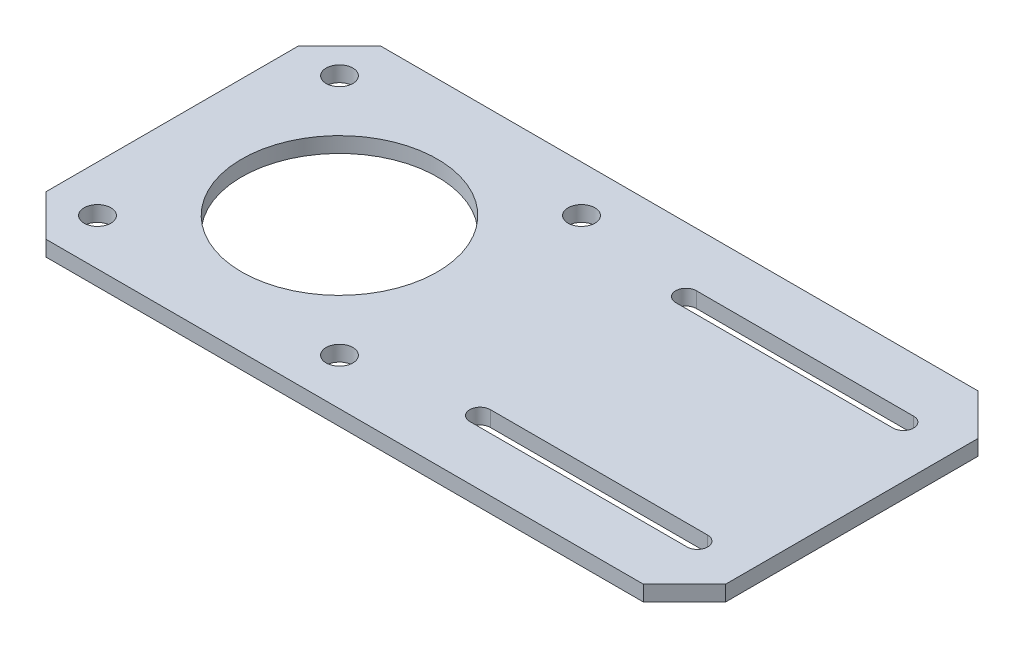
ISO-10303-21;
HEADER;
FILE_DESCRIPTION(('STEP AP214'),'2;1');
FILE_NAME('part.step','',(''),(''),'','','');
FILE_SCHEMA(('AUTOMOTIVE_DESIGN { 1 0 10303 214 1 1 1 1 }'));
ENDSEC;
DATA;
#1=APPLICATION_CONTEXT('core data for automotive mechanical design processes');
#2=APPLICATION_PROTOCOL_DEFINITION('international standard','automotive_design',2000,#1);
#3=PRODUCT_CONTEXT('',#1,'mechanical');
#4=PRODUCT('Part','Part','',(#3));
#5=PRODUCT_RELATED_PRODUCT_CATEGORY('part','',(#4));
#6=PRODUCT_DEFINITION_FORMATION('','',#4);
#7=PRODUCT_DEFINITION_CONTEXT('part definition',#1,'design');
#8=PRODUCT_DEFINITION('design','',#6,#7);
#9=PRODUCT_DEFINITION_SHAPE('','',#8);
#10=(LENGTH_UNIT() NAMED_UNIT(*) SI_UNIT(.MILLI.,.METRE.));
#11=(NAMED_UNIT(*) PLANE_ANGLE_UNIT() SI_UNIT($,.RADIAN.));
#12=(NAMED_UNIT(*) SI_UNIT($,.STERADIAN.) SOLID_ANGLE_UNIT());
#13=UNCERTAINTY_MEASURE_WITH_UNIT(LENGTH_MEASURE(1.E-05),#10,'distance_accuracy_value','');
#14=(GEOMETRIC_REPRESENTATION_CONTEXT(3) GLOBAL_UNCERTAINTY_ASSIGNED_CONTEXT((#13)) GLOBAL_UNIT_ASSIGNED_CONTEXT((#10,
#11,#12)) REPRESENTATION_CONTEXT('',''));
#15=CARTESIAN_POINT('',(0.,0.,0.));
#16=DIRECTION('',(0.,0.,1.));
#17=DIRECTION('',(1.,0.,0.));
#18=AXIS2_PLACEMENT_3D('',#15,#16,#17);
#19=CARTESIAN_POINT('',(0.,3.,0.));
#20=DIRECTION('',(1.,0.,0.));
#21=DIRECTION('',(0.,0.,-1.));
#22=AXIS2_PLACEMENT_3D('',#19,#20,#21);
#23=PLANE('',#22);
#24=DIRECTION('',(0.,0.,1.));
#25=VECTOR('',#24,1.);
#26=CARTESIAN_POINT('',(0.,0.,0.));
#27=LINE('',#26,#25);
#28=CARTESIAN_POINT('',(0.,0.,8.00000000000002));
#29=VERTEX_POINT('',#28);
#30=CARTESIAN_POINT('',(0.,0.,57.));
#31=VERTEX_POINT('',#30);
#32=EDGE_CURVE('E253',#29,#31,#27,.T.);
#33=ORIENTED_EDGE('',*,*,#32,.T.);
#34=DIRECTION('',(0.,1.,0.));
#35=VECTOR('',#34,1.);
#36=CARTESIAN_POINT('',(0.,3.,57.));
#37=LINE('',#36,#35);
#38=CARTESIAN_POINT('',(0.,3.,57.));
#39=VERTEX_POINT('',#38);
#40=EDGE_CURVE('E295',#31,#39,#37,.T.);
#41=ORIENTED_EDGE('',*,*,#40,.T.);
#42=DIRECTION('',(0.,0.,1.));
#43=VECTOR('',#42,1.);
#44=CARTESIAN_POINT('',(0.,3.,0.));
#45=LINE('',#44,#43);
#46=CARTESIAN_POINT('',(0.,3.,8.00000000000002));
#47=VERTEX_POINT('',#46);
#48=EDGE_CURVE('E256',#47,#39,#45,.T.);
#49=ORIENTED_EDGE('',*,*,#48,.F.);
#50=DIRECTION('',(0.,-1.,0.));
#51=VECTOR('',#50,1.);
#52=CARTESIAN_POINT('',(0.,3.,8.00000000000002));
#53=LINE('',#52,#51);
#54=EDGE_CURVE('E292',#47,#29,#53,.T.);
#55=ORIENTED_EDGE('',*,*,#54,.T.);
#56=EDGE_LOOP('',(#33,#41,#49,#55));
#57=FACE_BOUND('',#56,.T.);
#58=ADVANCED_FACE('F43',(#57),#23,.F.);
#59=CARTESIAN_POINT('',(0.,3.,65.));
#60=DIRECTION('',(0.,0.,-1.));
#61=DIRECTION('',(-1.,0.,0.));
#62=AXIS2_PLACEMENT_3D('',#59,#60,#61);
#63=PLANE('',#62);
#64=DIRECTION('',(1.,0.,0.));
#65=VECTOR('',#64,1.);
#66=CARTESIAN_POINT('',(0.,3.,65.));
#67=LINE('',#66,#65);
#68=CARTESIAN_POINT('',(8.,3.,65.));
#69=VERTEX_POINT('',#68);
#70=CARTESIAN_POINT('',(124.,3.,65.));
#71=VERTEX_POINT('',#70);
#72=EDGE_CURVE('E259',#69,#71,#67,.T.);
#73=ORIENTED_EDGE('',*,*,#72,.F.);
#74=DIRECTION('',(0.,-1.,0.));
#75=VECTOR('',#74,1.);
#76=CARTESIAN_POINT('',(8.,3.,65.));
#77=LINE('',#76,#75);
#78=CARTESIAN_POINT('',(8.,0.,65.));
#79=VERTEX_POINT('',#78);
#80=EDGE_CURVE('E281',#69,#79,#77,.T.);
#81=ORIENTED_EDGE('',*,*,#80,.T.);
#82=DIRECTION('',(1.,0.,0.));
#83=VECTOR('',#82,1.);
#84=CARTESIAN_POINT('',(0.,0.,65.));
#85=LINE('',#84,#83);
#86=CARTESIAN_POINT('',(124.,0.,65.));
#87=VERTEX_POINT('',#86);
#88=EDGE_CURVE('E272',#79,#87,#85,.T.);
#89=ORIENTED_EDGE('',*,*,#88,.T.);
#90=DIRECTION('',(0.,1.,0.));
#91=VECTOR('',#90,1.);
#92=CARTESIAN_POINT('',(124.,3.,65.));
#93=LINE('',#92,#91);
#94=EDGE_CURVE('E269',#87,#71,#93,.T.);
#95=ORIENTED_EDGE('',*,*,#94,.T.);
#96=EDGE_LOOP('',(#73,#81,#89,#95));
#97=FACE_BOUND('',#96,.T.);
#98=ADVANCED_FACE('F345',(#97),#63,.F.);
#99=CARTESIAN_POINT('',(132.,3.,0.));
#100=DIRECTION('',(-1.,0.,0.));
#101=DIRECTION('',(0.,0.,1.));
#102=AXIS2_PLACEMENT_3D('',#99,#100,#101);
#103=PLANE('',#102);
#104=DIRECTION('',(0.,0.,-1.));
#105=VECTOR('',#104,1.);
#106=CARTESIAN_POINT('',(132.,0.,0.));
#107=LINE('',#106,#105);
#108=CARTESIAN_POINT('',(132.,0.,57.));
#109=VERTEX_POINT('',#108);
#110=CARTESIAN_POINT('',(132.,0.,8.00000000000005));
#111=VERTEX_POINT('',#110);
#112=EDGE_CURVE('E275',#109,#111,#107,.T.);
#113=ORIENTED_EDGE('',*,*,#112,.T.);
#114=DIRECTION('',(0.,1.,0.));
#115=VECTOR('',#114,1.);
#116=CARTESIAN_POINT('',(132.,3.,8.00000000000005));
#117=LINE('',#116,#115);
#118=CARTESIAN_POINT('',(132.,3.,8.00000000000005));
#119=VERTEX_POINT('',#118);
#120=EDGE_CURVE('E11',#111,#119,#117,.T.);
#121=ORIENTED_EDGE('',*,*,#120,.T.);
#122=DIRECTION('',(0.,0.,-1.));
#123=VECTOR('',#122,1.);
#124=CARTESIAN_POINT('',(132.,3.,0.));
#125=LINE('',#124,#123);
#126=CARTESIAN_POINT('',(132.,3.,57.));
#127=VERTEX_POINT('',#126);
#128=EDGE_CURVE('E263',#127,#119,#125,.T.);
#129=ORIENTED_EDGE('',*,*,#128,.F.);
#130=DIRECTION('',(0.,-1.,0.));
#131=VECTOR('',#130,1.);
#132=CARTESIAN_POINT('',(132.,3.,57.));
#133=LINE('',#132,#131);
#134=EDGE_CURVE('E52',#127,#109,#133,.T.);
#135=ORIENTED_EDGE('',*,*,#134,.T.);
#136=EDGE_LOOP('',(#113,#121,#129,#135));
#137=FACE_BOUND('',#136,.T.);
#138=ADVANCED_FACE('F314',(#137),#103,.F.);
#139=CARTESIAN_POINT('',(0.,3.,0.));
#140=DIRECTION('',(0.,0.,1.));
#141=DIRECTION('',(1.,0.,0.));
#142=AXIS2_PLACEMENT_3D('',#139,#140,#141);
#143=PLANE('',#142);
#144=DIRECTION('',(-1.,0.,0.));
#145=VECTOR('',#144,1.);
#146=CARTESIAN_POINT('',(0.,0.,0.));
#147=LINE('',#146,#145);
#148=CARTESIAN_POINT('',(124.,0.,0.));
#149=VERTEX_POINT('',#148);
#150=CARTESIAN_POINT('',(8.00000000000005,0.,0.));
#151=VERTEX_POINT('',#150);
#152=EDGE_CURVE('E260',#149,#151,#147,.T.);
#153=ORIENTED_EDGE('',*,*,#152,.T.);
#154=DIRECTION('',(0.,1.,0.));
#155=VECTOR('',#154,1.);
#156=CARTESIAN_POINT('',(8.00000000000005,3.,0.));
#157=LINE('',#156,#155);
#158=CARTESIAN_POINT('',(8.00000000000005,3.,0.));
#159=VERTEX_POINT('',#158);
#160=EDGE_CURVE('E308',#151,#159,#157,.T.);
#161=ORIENTED_EDGE('',*,*,#160,.T.);
#162=DIRECTION('',(-1.,0.,0.));
#163=VECTOR('',#162,1.);
#164=CARTESIAN_POINT('',(0.,3.,0.));
#165=LINE('',#164,#163);
#166=CARTESIAN_POINT('',(124.,3.,0.));
#167=VERTEX_POINT('',#166);
#168=EDGE_CURVE('E266',#167,#159,#165,.T.);
#169=ORIENTED_EDGE('',*,*,#168,.F.);
#170=DIRECTION('',(0.,-1.,0.));
#171=VECTOR('',#170,1.);
#172=CARTESIAN_POINT('',(124.,3.,0.));
#173=LINE('',#172,#171);
#174=EDGE_CURVE('E305',#167,#149,#173,.T.);
#175=ORIENTED_EDGE('',*,*,#174,.T.);
#176=EDGE_LOOP('',(#153,#161,#169,#175));
#177=FACE_BOUND('',#176,.T.);
#178=ADVANCED_FACE('F327',(#177),#143,.F.);
#179=CARTESIAN_POINT('',(0.,3.,0.));
#180=DIRECTION('',(0.,1.,0.));
#181=DIRECTION('',(0.,0.,1.));
#182=AXIS2_PLACEMENT_3D('',#179,#180,#181);
#183=PLANE('',#182);
#184=CARTESIAN_POINT('',(122.,3.,12.5));
#185=DIRECTION('',(0.,1.,0.));
#186=DIRECTION('',(0.,0.,1.));
#187=AXIS2_PLACEMENT_3D('',#184,#185,#186);
#188=CIRCLE('',#187,2.);
#189=CARTESIAN_POINT('',(122.,3.,14.5));
#190=VERTEX_POINT('',#189);
#191=CARTESIAN_POINT('',(122.,3.,10.5));
#192=VERTEX_POINT('',#191);
#193=EDGE_CURVE('E59',#190,#192,#188,.T.);
#194=ORIENTED_EDGE('',*,*,#193,.F.);
#195=DIRECTION('',(1.,0.,0.));
#196=VECTOR('',#195,1.);
#197=CARTESIAN_POINT('',(122.,3.,14.5));
#198=LINE('',#197,#196);
#199=CARTESIAN_POINT('',(79.8,3.,14.5));
#200=VERTEX_POINT('',#199);
#201=EDGE_CURVE('E177',#200,#190,#198,.T.);
#202=ORIENTED_EDGE('',*,*,#201,.F.);
#203=CARTESIAN_POINT('',(79.8,3.,12.5));
#204=DIRECTION('',(0.,1.,0.));
#205=DIRECTION('',(0.,0.,1.));
#206=AXIS2_PLACEMENT_3D('',#203,#204,#205);
#207=CIRCLE('',#206,2.);
#208=CARTESIAN_POINT('',(79.8,3.,10.5));
#209=VERTEX_POINT('',#208);
#210=EDGE_CURVE('E180',#209,#200,#207,.T.);
#211=ORIENTED_EDGE('',*,*,#210,.F.);
#212=DIRECTION('',(-1.,0.,0.));
#213=VECTOR('',#212,1.);
#214=CARTESIAN_POINT('',(122.,3.,10.5));
#215=LINE('',#214,#213);
#216=EDGE_CURVE('E186',#192,#209,#215,.T.);
#217=ORIENTED_EDGE('',*,*,#216,.F.);
#218=EDGE_LOOP('',(#194,#202,#211,#217));
#219=FACE_BOUND('',#218,.T.);
#220=CARTESIAN_POINT('',(122.,3.,52.5));
#221=DIRECTION('',(0.,1.,0.));
#222=DIRECTION('',(0.,0.,1.));
#223=AXIS2_PLACEMENT_3D('',#220,#221,#222);
#224=CIRCLE('',#223,2.00000000000001);
#225=CARTESIAN_POINT('',(122.,3.,54.5));
#226=VERTEX_POINT('',#225);
#227=CARTESIAN_POINT('',(122.,3.,50.5));
#228=VERTEX_POINT('',#227);
#229=EDGE_CURVE('E67',#226,#228,#224,.T.);
#230=ORIENTED_EDGE('',*,*,#229,.F.);
#231=DIRECTION('',(1.,0.,0.));
#232=VECTOR('',#231,1.);
#233=CARTESIAN_POINT('',(122.,3.,54.5));
#234=LINE('',#233,#232);
#235=CARTESIAN_POINT('',(79.8,3.,54.5));
#236=VERTEX_POINT('',#235);
#237=EDGE_CURVE('E205',#236,#226,#234,.T.);
#238=ORIENTED_EDGE('',*,*,#237,.F.);
#239=CARTESIAN_POINT('',(79.8,3.,52.5));
#240=DIRECTION('',(0.,1.,0.));
#241=DIRECTION('',(0.,0.,1.));
#242=AXIS2_PLACEMENT_3D('',#239,#240,#241);
#243=CIRCLE('',#242,2.);
#244=CARTESIAN_POINT('',(79.8,3.,50.5));
#245=VERTEX_POINT('',#244);
#246=EDGE_CURVE('E208',#245,#236,#243,.T.);
#247=ORIENTED_EDGE('',*,*,#246,.F.);
#248=DIRECTION('',(-1.,0.,0.));
#249=VECTOR('',#248,1.);
#250=CARTESIAN_POINT('',(122.,3.,50.5));
#251=LINE('',#250,#249);
#252=EDGE_CURVE('E212',#228,#245,#251,.T.);
#253=ORIENTED_EDGE('',*,*,#252,.F.);
#254=EDGE_LOOP('',(#230,#238,#247,#253));
#255=FACE_BOUND('',#254,.T.);
#256=CARTESIAN_POINT('',(9.,3.,9.));
#257=DIRECTION('',(0.,1.,0.));
#258=DIRECTION('',(0.,0.,-1.));
#259=AXIS2_PLACEMENT_3D('',#256,#257,#258);
#260=CIRCLE('',#259,2.6);
#261=CARTESIAN_POINT('',(9.,3.,6.4));
#262=VERTEX_POINT('',#261);
#263=EDGE_CURVE('E245',#262,#262,#260,.T.);
#264=ORIENTED_EDGE('',*,*,#263,.F.);
#265=EDGE_LOOP('',(#264));
#266=FACE_BOUND('',#265,.T.);
#267=CARTESIAN_POINT('',(56.,3.,9.));
#268=DIRECTION('',(0.,1.,0.));
#269=DIRECTION('',(0.,0.,1.));
#270=AXIS2_PLACEMENT_3D('',#267,#268,#269);
#271=CIRCLE('',#270,2.6);
#272=CARTESIAN_POINT('',(56.,3.,11.6));
#273=VERTEX_POINT('',#272);
#274=EDGE_CURVE('E239',#273,#273,#271,.T.);
#275=ORIENTED_EDGE('',*,*,#274,.F.);
#276=EDGE_LOOP('',(#275));
#277=FACE_BOUND('',#276,.T.);
#278=CARTESIAN_POINT('',(56.,3.,56.));
#279=DIRECTION('',(0.,1.,0.));
#280=DIRECTION('',(0.,0.,-1.));
#281=AXIS2_PLACEMENT_3D('',#278,#279,#280);
#282=CIRCLE('',#281,2.6);
#283=CARTESIAN_POINT('',(56.,3.,53.4));
#284=VERTEX_POINT('',#283);
#285=EDGE_CURVE('E233',#284,#284,#282,.T.);
#286=ORIENTED_EDGE('',*,*,#285,.F.);
#287=EDGE_LOOP('',(#286));
#288=FACE_BOUND('',#287,.T.);
#289=CARTESIAN_POINT('',(9.,3.,56.));
#290=DIRECTION('',(0.,1.,0.));
#291=DIRECTION('',(0.,0.,1.));
#292=AXIS2_PLACEMENT_3D('',#289,#290,#291);
#293=CIRCLE('',#292,2.6);
#294=CARTESIAN_POINT('',(9.,3.,58.6));
#295=VERTEX_POINT('',#294);
#296=EDGE_CURVE('E226',#295,#295,#293,.T.);
#297=ORIENTED_EDGE('',*,*,#296,.F.);
#298=EDGE_LOOP('',(#297));
#299=FACE_BOUND('',#298,.T.);
#300=CARTESIAN_POINT('',(32.5,3.,32.5));
#301=DIRECTION('',(0.,1.,0.));
#302=DIRECTION('',(0.,0.,1.));
#303=AXIS2_PLACEMENT_3D('',#300,#301,#302);
#304=CIRCLE('',#303,19.);
#305=CARTESIAN_POINT('',(32.5,3.,51.5));
#306=VERTEX_POINT('',#305);
#307=EDGE_CURVE('E229',#306,#306,#304,.T.);
#308=ORIENTED_EDGE('',*,*,#307,.F.);
#309=EDGE_LOOP('',(#308));
#310=FACE_BOUND('',#309,.T.);
#311=ORIENTED_EDGE('',*,*,#48,.T.);
#312=DIRECTION('',(-0.707106781186547,0.,-0.707106781186548));
#313=VECTOR('',#312,1.);
#314=CARTESIAN_POINT('',(-28.5,3.,28.4999999999999));
#315=LINE('',#314,#313);
#316=EDGE_CURVE('E303',#39,#69,#315,.F.);
#317=ORIENTED_EDGE('',*,*,#316,.T.);
#318=ORIENTED_EDGE('',*,*,#72,.T.);
#319=DIRECTION('',(-0.707106781186549,0.,0.707106781186546));
#320=VECTOR('',#319,1.);
#321=CARTESIAN_POINT('',(94.4999999999998,3.,94.5000000000001));
#322=LINE('',#321,#320);
#323=EDGE_CURVE('E297',#71,#127,#322,.F.);
#324=ORIENTED_EDGE('',*,*,#323,.T.);
#325=ORIENTED_EDGE('',*,*,#128,.T.);
#326=DIRECTION('',(0.707106781186546,0.,0.707106781186549));
#327=VECTOR('',#326,1.);
#328=CARTESIAN_POINT('',(62.0000000000003,3.,-62.));
#329=LINE('',#328,#327);
#330=EDGE_CURVE('E299',#119,#167,#329,.F.);
#331=ORIENTED_EDGE('',*,*,#330,.T.);
#332=ORIENTED_EDGE('',*,*,#168,.T.);
#333=DIRECTION('',(0.707106781186549,0.,-0.707106781186546));
#334=VECTOR('',#333,1.);
#335=CARTESIAN_POINT('',(4.00000000000001,3.,4.00000000000002));
#336=LINE('',#335,#334);
#337=EDGE_CURVE('E301',#159,#47,#336,.F.);
#338=ORIENTED_EDGE('',*,*,#337,.T.);
#339=EDGE_LOOP('',(#311,#317,#318,#324,#325,#331,#332,#338));
#340=FACE_BOUND('',#339,.T.);
#341=ADVANCED_FACE('F331',(#219,#255,#266,#277,#288,#299,#310,#340),#183,.T.);
#342=CARTESIAN_POINT('',(0.,0.,0.));
#343=DIRECTION('',(0.,1.,0.));
#344=DIRECTION('',(0.,0.,1.));
#345=AXIS2_PLACEMENT_3D('',#342,#343,#344);
#346=PLANE('',#345);
#347=DIRECTION('',(1.,0.,0.));
#348=VECTOR('',#347,1.);
#349=CARTESIAN_POINT('',(122.,0.,14.5));
#350=LINE('',#349,#348);
#351=CARTESIAN_POINT('',(79.8,0.,14.5));
#352=VERTEX_POINT('',#351);
#353=CARTESIAN_POINT('',(122.,0.,14.5));
#354=VERTEX_POINT('',#353);
#355=EDGE_CURVE('E164',#352,#354,#350,.T.);
#356=ORIENTED_EDGE('',*,*,#355,.T.);
#357=CARTESIAN_POINT('',(122.,0.,12.5));
#358=DIRECTION('',(0.,1.,0.));
#359=DIRECTION('',(0.,0.,1.));
#360=AXIS2_PLACEMENT_3D('',#357,#358,#359);
#361=CIRCLE('',#360,2.);
#362=CARTESIAN_POINT('',(122.,0.,10.5));
#363=VERTEX_POINT('',#362);
#364=EDGE_CURVE('E158',#354,#363,#361,.T.);
#365=ORIENTED_EDGE('',*,*,#364,.T.);
#366=DIRECTION('',(-1.,0.,0.));
#367=VECTOR('',#366,1.);
#368=CARTESIAN_POINT('',(122.,0.,10.5));
#369=LINE('',#368,#367);
#370=CARTESIAN_POINT('',(79.8,0.,10.5));
#371=VERTEX_POINT('',#370);
#372=EDGE_CURVE('E168',#363,#371,#369,.T.);
#373=ORIENTED_EDGE('',*,*,#372,.T.);
#374=CARTESIAN_POINT('',(79.8,0.,12.5));
#375=DIRECTION('',(0.,1.,0.));
#376=DIRECTION('',(0.,0.,1.));
#377=AXIS2_PLACEMENT_3D('',#374,#375,#376);
#378=CIRCLE('',#377,2.);
#379=EDGE_CURVE('E172',#371,#352,#378,.T.);
#380=ORIENTED_EDGE('',*,*,#379,.T.);
#381=EDGE_LOOP('',(#356,#365,#373,#380));
#382=FACE_BOUND('',#381,.T.);
#383=DIRECTION('',(1.,0.,0.));
#384=VECTOR('',#383,1.);
#385=CARTESIAN_POINT('',(122.,0.,54.5));
#386=LINE('',#385,#384);
#387=CARTESIAN_POINT('',(79.8,0.,54.5));
#388=VERTEX_POINT('',#387);
#389=CARTESIAN_POINT('',(122.,0.,54.5));
#390=VERTEX_POINT('',#389);
#391=EDGE_CURVE('E198',#388,#390,#386,.T.);
#392=ORIENTED_EDGE('',*,*,#391,.T.);
#393=CARTESIAN_POINT('',(122.,0.,52.5));
#394=DIRECTION('',(0.,1.,0.));
#395=DIRECTION('',(0.,0.,1.));
#396=AXIS2_PLACEMENT_3D('',#393,#394,#395);
#397=CIRCLE('',#396,2.00000000000001);
#398=CARTESIAN_POINT('',(122.,0.,50.5));
#399=VERTEX_POINT('',#398);
#400=EDGE_CURVE('E209',#390,#399,#397,.T.);
#401=ORIENTED_EDGE('',*,*,#400,.T.);
#402=DIRECTION('',(-1.,0.,0.));
#403=VECTOR('',#402,1.);
#404=CARTESIAN_POINT('',(122.,0.,50.5));
#405=LINE('',#404,#403);
#406=CARTESIAN_POINT('',(79.8,0.,50.5));
#407=VERTEX_POINT('',#406);
#408=EDGE_CURVE('E221',#399,#407,#405,.T.);
#409=ORIENTED_EDGE('',*,*,#408,.T.);
#410=CARTESIAN_POINT('',(79.8,0.,52.5));
#411=DIRECTION('',(0.,1.,0.));
#412=DIRECTION('',(0.,0.,1.));
#413=AXIS2_PLACEMENT_3D('',#410,#411,#412);
#414=CIRCLE('',#413,2.);
#415=EDGE_CURVE('E218',#407,#388,#414,.T.);
#416=ORIENTED_EDGE('',*,*,#415,.T.);
#417=EDGE_LOOP('',(#392,#401,#409,#416));
#418=FACE_BOUND('',#417,.T.);
#419=CARTESIAN_POINT('',(9.,0.,9.));
#420=DIRECTION('',(0.,1.,0.));
#421=DIRECTION('',(0.,0.,-1.));
#422=AXIS2_PLACEMENT_3D('',#419,#420,#421);
#423=CIRCLE('',#422,2.6);
#424=CARTESIAN_POINT('',(9.,0.,6.4));
#425=VERTEX_POINT('',#424);
#426=EDGE_CURVE('E192',#425,#425,#423,.T.);
#427=ORIENTED_EDGE('',*,*,#426,.T.);
#428=EDGE_LOOP('',(#427));
#429=FACE_BOUND('',#428,.T.);
#430=CARTESIAN_POINT('',(56.,0.,9.));
#431=DIRECTION('',(0.,1.,0.));
#432=DIRECTION('',(0.,0.,1.));
#433=AXIS2_PLACEMENT_3D('',#430,#431,#432);
#434=CIRCLE('',#433,2.6);
#435=CARTESIAN_POINT('',(56.,0.,11.6));
#436=VERTEX_POINT('',#435);
#437=EDGE_CURVE('E242',#436,#436,#434,.T.);
#438=ORIENTED_EDGE('',*,*,#437,.T.);
#439=EDGE_LOOP('',(#438));
#440=FACE_BOUND('',#439,.T.);
#441=CARTESIAN_POINT('',(56.,0.,56.));
#442=DIRECTION('',(0.,1.,0.));
#443=DIRECTION('',(0.,0.,-1.));
#444=AXIS2_PLACEMENT_3D('',#441,#442,#443);
#445=CIRCLE('',#444,2.6);
#446=CARTESIAN_POINT('',(56.,0.,53.4));
#447=VERTEX_POINT('',#446);
#448=EDGE_CURVE('E236',#447,#447,#445,.T.);
#449=ORIENTED_EDGE('',*,*,#448,.T.);
#450=EDGE_LOOP('',(#449));
#451=FACE_BOUND('',#450,.T.);
#452=CARTESIAN_POINT('',(9.,0.,56.));
#453=DIRECTION('',(0.,1.,0.));
#454=DIRECTION('',(0.,0.,1.));
#455=AXIS2_PLACEMENT_3D('',#452,#453,#454);
#456=CIRCLE('',#455,2.6);
#457=CARTESIAN_POINT('',(9.,0.,58.6));
#458=VERTEX_POINT('',#457);
#459=EDGE_CURVE('E230',#458,#458,#456,.T.);
#460=ORIENTED_EDGE('',*,*,#459,.T.);
#461=EDGE_LOOP('',(#460));
#462=FACE_BOUND('',#461,.T.);
#463=CARTESIAN_POINT('',(32.5,0.,32.5));
#464=DIRECTION('',(0.,1.,0.));
#465=DIRECTION('',(0.,0.,1.));
#466=AXIS2_PLACEMENT_3D('',#463,#464,#465);
#467=CIRCLE('',#466,19.);
#468=CARTESIAN_POINT('',(32.5,0.,51.5));
#469=VERTEX_POINT('',#468);
#470=EDGE_CURVE('E250',#469,#469,#467,.T.);
#471=ORIENTED_EDGE('',*,*,#470,.T.);
#472=EDGE_LOOP('',(#471));
#473=FACE_BOUND('',#472,.T.);
#474=ORIENTED_EDGE('',*,*,#88,.F.);
#475=DIRECTION('',(0.707106781186547,0.,0.707106781186548));
#476=VECTOR('',#475,1.);
#477=CARTESIAN_POINT('',(8.,0.,65.));
#478=LINE('',#477,#476);
#479=EDGE_CURVE('E290',#79,#31,#478,.F.);
#480=ORIENTED_EDGE('',*,*,#479,.T.);
#481=ORIENTED_EDGE('',*,*,#32,.F.);
#482=DIRECTION('',(-0.707106781186549,0.,0.707106781186546));
#483=VECTOR('',#482,1.);
#484=CARTESIAN_POINT('',(0.,0.,8.00000000000002));
#485=LINE('',#484,#483);
#486=EDGE_CURVE('E288',#29,#151,#485,.F.);
#487=ORIENTED_EDGE('',*,*,#486,.T.);
#488=ORIENTED_EDGE('',*,*,#152,.F.);
#489=DIRECTION('',(-0.707106781186546,0.,-0.707106781186549));
#490=VECTOR('',#489,1.);
#491=CARTESIAN_POINT('',(124.,0.,0.));
#492=LINE('',#491,#490);
#493=EDGE_CURVE('E286',#149,#111,#492,.F.);
#494=ORIENTED_EDGE('',*,*,#493,.T.);
#495=ORIENTED_EDGE('',*,*,#112,.F.);
#496=DIRECTION('',(0.707106781186549,0.,-0.707106781186546));
#497=VECTOR('',#496,1.);
#498=CARTESIAN_POINT('',(132.,0.,57.));
#499=LINE('',#498,#497);
#500=EDGE_CURVE('E284',#109,#87,#499,.F.);
#501=ORIENTED_EDGE('',*,*,#500,.T.);
#502=EDGE_LOOP('',(#474,#480,#481,#487,#488,#494,#495,#501));
#503=FACE_BOUND('',#502,.T.);
#504=ADVANCED_FACE('F174',(#382,#418,#429,#440,#451,#462,#473,#503),#346,.F.);
#505=CARTESIAN_POINT('',(8.,3.,65.));
#506=DIRECTION('',(0.707106781186548,0.,-0.707106781186547));
#507=DIRECTION('',(0.,-1.,0.));
#508=AXIS2_PLACEMENT_3D('',#505,#506,#507);
#509=PLANE('',#508);
#510=ORIENTED_EDGE('',*,*,#316,.F.);
#511=ORIENTED_EDGE('',*,*,#40,.F.);
#512=ORIENTED_EDGE('',*,*,#479,.F.);
#513=ORIENTED_EDGE('',*,*,#80,.F.);
#514=EDGE_LOOP('',(#510,#511,#512,#513));
#515=FACE_BOUND('',#514,.T.);
#516=ADVANCED_FACE('F342',(#515),#509,.F.);
#517=CARTESIAN_POINT('',(0.,3.,8.00000000000002));
#518=DIRECTION('',(0.707106781186546,0.,0.707106781186549));
#519=DIRECTION('',(0.,-1.,0.));
#520=AXIS2_PLACEMENT_3D('',#517,#518,#519);
#521=PLANE('',#520);
#522=ORIENTED_EDGE('',*,*,#337,.F.);
#523=ORIENTED_EDGE('',*,*,#160,.F.);
#524=ORIENTED_EDGE('',*,*,#486,.F.);
#525=ORIENTED_EDGE('',*,*,#54,.F.);
#526=EDGE_LOOP('',(#522,#523,#524,#525));
#527=FACE_BOUND('',#526,.T.);
#528=ADVANCED_FACE('F335',(#527),#521,.F.);
#529=CARTESIAN_POINT('',(124.,3.,0.));
#530=DIRECTION('',(-0.707106781186549,0.,0.707106781186546));
#531=DIRECTION('',(0.,-1.,0.));
#532=AXIS2_PLACEMENT_3D('',#529,#530,#531);
#533=PLANE('',#532);
#534=ORIENTED_EDGE('',*,*,#330,.F.);
#535=ORIENTED_EDGE('',*,*,#120,.F.);
#536=ORIENTED_EDGE('',*,*,#493,.F.);
#537=ORIENTED_EDGE('',*,*,#174,.F.);
#538=EDGE_LOOP('',(#534,#535,#536,#537));
#539=FACE_BOUND('',#538,.T.);
#540=ADVANCED_FACE('F324',(#539),#533,.F.);
#541=CARTESIAN_POINT('',(132.,3.,57.));
#542=DIRECTION('',(-0.707106781186546,0.,-0.707106781186549));
#543=DIRECTION('',(0.,-1.,0.));
#544=AXIS2_PLACEMENT_3D('',#541,#542,#543);
#545=PLANE('',#544);
#546=ORIENTED_EDGE('',*,*,#323,.F.);
#547=ORIENTED_EDGE('',*,*,#94,.F.);
#548=ORIENTED_EDGE('',*,*,#500,.F.);
#549=ORIENTED_EDGE('',*,*,#134,.F.);
#550=EDGE_LOOP('',(#546,#547,#548,#549));
#551=FACE_BOUND('',#550,.T.);
#552=ADVANCED_FACE('F46',(#551),#545,.F.);
#553=CARTESIAN_POINT('',(32.5,0.,32.5));
#554=DIRECTION('',(0.,1.,0.));
#555=DIRECTION('',(0.,0.,1.));
#556=AXIS2_PLACEMENT_3D('',#553,#554,#555);
#557=CYLINDRICAL_SURFACE('',#556,19.);
#558=ORIENTED_EDGE('',*,*,#470,.F.);
#559=EDGE_LOOP('',(#558));
#560=FACE_BOUND('',#559,.T.);
#561=ORIENTED_EDGE('',*,*,#307,.T.);
#562=EDGE_LOOP('',(#561));
#563=FACE_BOUND('',#562,.T.);
#564=ADVANCED_FACE('F348',(#560,#563),#557,.F.);
#565=CARTESIAN_POINT('',(9.,0.,56.));
#566=DIRECTION('',(0.,1.,0.));
#567=DIRECTION('',(0.,0.,1.));
#568=AXIS2_PLACEMENT_3D('',#565,#566,#567);
#569=CYLINDRICAL_SURFACE('',#568,2.6);
#570=ORIENTED_EDGE('',*,*,#459,.F.);
#571=EDGE_LOOP('',(#570));
#572=FACE_BOUND('',#571,.T.);
#573=ORIENTED_EDGE('',*,*,#296,.T.);
#574=EDGE_LOOP('',(#573));
#575=FACE_BOUND('',#574,.T.);
#576=ADVANCED_FACE('F353',(#572,#575),#569,.F.);
#577=CARTESIAN_POINT('',(56.,0.,56.));
#578=DIRECTION('',(0.,1.,0.));
#579=DIRECTION('',(0.,0.,1.));
#580=AXIS2_PLACEMENT_3D('',#577,#578,#579);
#581=CYLINDRICAL_SURFACE('',#580,2.6);
#582=ORIENTED_EDGE('',*,*,#448,.F.);
#583=EDGE_LOOP('',(#582));
#584=FACE_BOUND('',#583,.T.);
#585=ORIENTED_EDGE('',*,*,#285,.T.);
#586=EDGE_LOOP('',(#585));
#587=FACE_BOUND('',#586,.T.);
#588=ADVANCED_FACE('F408',(#584,#587),#581,.F.);
#589=CARTESIAN_POINT('',(56.,0.,9.));
#590=DIRECTION('',(0.,1.,0.));
#591=DIRECTION('',(0.,0.,1.));
#592=AXIS2_PLACEMENT_3D('',#589,#590,#591);
#593=CYLINDRICAL_SURFACE('',#592,2.6);
#594=ORIENTED_EDGE('',*,*,#437,.F.);
#595=EDGE_LOOP('',(#594));
#596=FACE_BOUND('',#595,.T.);
#597=ORIENTED_EDGE('',*,*,#274,.T.);
#598=EDGE_LOOP('',(#597));
#599=FACE_BOUND('',#598,.T.);
#600=ADVANCED_FACE('F418',(#596,#599),#593,.F.);
#601=CARTESIAN_POINT('',(9.,0.,9.));
#602=DIRECTION('',(0.,1.,0.));
#603=DIRECTION('',(0.,0.,1.));
#604=AXIS2_PLACEMENT_3D('',#601,#602,#603);
#605=CYLINDRICAL_SURFACE('',#604,2.6);
#606=ORIENTED_EDGE('',*,*,#426,.F.);
#607=EDGE_LOOP('',(#606));
#608=FACE_BOUND('',#607,.T.);
#609=ORIENTED_EDGE('',*,*,#263,.T.);
#610=EDGE_LOOP('',(#609));
#611=FACE_BOUND('',#610,.T.);
#612=ADVANCED_FACE('F428',(#608,#611),#605,.F.);
#613=CARTESIAN_POINT('',(122.,0.,52.5));
#614=DIRECTION('',(0.,1.,0.));
#615=DIRECTION('',(0.,0.,1.));
#616=AXIS2_PLACEMENT_3D('',#613,#614,#615);
#617=CYLINDRICAL_SURFACE('',#616,2.00000000000001);
#618=ORIENTED_EDGE('',*,*,#229,.T.);
#619=DIRECTION('',(0.,1.,0.));
#620=VECTOR('',#619,1.);
#621=CARTESIAN_POINT('',(122.,0.,50.5));
#622=LINE('',#621,#620);
#623=EDGE_CURVE('E196',#399,#228,#622,.T.);
#624=ORIENTED_EDGE('',*,*,#623,.F.);
#625=ORIENTED_EDGE('',*,*,#400,.F.);
#626=DIRECTION('',(0.,1.,0.));
#627=VECTOR('',#626,1.);
#628=CARTESIAN_POINT('',(122.,0.,54.5));
#629=LINE('',#628,#627);
#630=EDGE_CURVE('E203',#390,#226,#629,.T.);
#631=ORIENTED_EDGE('',*,*,#630,.T.);
#632=EDGE_LOOP('',(#618,#624,#625,#631));
#633=FACE_BOUND('',#632,.T.);
#634=ADVANCED_FACE('F438',(#633),#617,.F.);
#635=CARTESIAN_POINT('',(122.,0.,54.5));
#636=DIRECTION('',(0.,0.,1.));
#637=DIRECTION('',(1.,0.,0.));
#638=AXIS2_PLACEMENT_3D('',#635,#636,#637);
#639=PLANE('',#638);
#640=ORIENTED_EDGE('',*,*,#237,.T.);
#641=ORIENTED_EDGE('',*,*,#630,.F.);
#642=ORIENTED_EDGE('',*,*,#391,.F.);
#643=DIRECTION('',(0.,1.,0.));
#644=VECTOR('',#643,1.);
#645=CARTESIAN_POINT('',(79.8,0.,54.5));
#646=LINE('',#645,#644);
#647=EDGE_CURVE('E201',#388,#236,#646,.T.);
#648=ORIENTED_EDGE('',*,*,#647,.T.);
#649=EDGE_LOOP('',(#640,#641,#642,#648));
#650=FACE_BOUND('',#649,.T.);
#651=ADVANCED_FACE('F449',(#650),#639,.F.);
#652=CARTESIAN_POINT('',(79.8,0.,52.5));
#653=DIRECTION('',(0.,1.,0.));
#654=DIRECTION('',(0.,0.,1.));
#655=AXIS2_PLACEMENT_3D('',#652,#653,#654);
#656=CYLINDRICAL_SURFACE('',#655,2.);
#657=ORIENTED_EDGE('',*,*,#246,.T.);
#658=ORIENTED_EDGE('',*,*,#647,.F.);
#659=ORIENTED_EDGE('',*,*,#415,.F.);
#660=DIRECTION('',(0.,1.,0.));
#661=VECTOR('',#660,1.);
#662=CARTESIAN_POINT('',(79.8,0.,50.5));
#663=LINE('',#662,#661);
#664=EDGE_CURVE('E199',#407,#245,#663,.T.);
#665=ORIENTED_EDGE('',*,*,#664,.T.);
#666=EDGE_LOOP('',(#657,#658,#659,#665));
#667=FACE_BOUND('',#666,.T.);
#668=ADVANCED_FACE('F459',(#667),#656,.F.);
#669=CARTESIAN_POINT('',(122.,0.,50.5));
#670=DIRECTION('',(0.,0.,-1.));
#671=DIRECTION('',(-1.,0.,0.));
#672=AXIS2_PLACEMENT_3D('',#669,#670,#671);
#673=PLANE('',#672);
#674=ORIENTED_EDGE('',*,*,#252,.T.);
#675=ORIENTED_EDGE('',*,*,#664,.F.);
#676=ORIENTED_EDGE('',*,*,#408,.F.);
#677=ORIENTED_EDGE('',*,*,#623,.T.);
#678=EDGE_LOOP('',(#674,#675,#676,#677));
#679=FACE_BOUND('',#678,.T.);
#680=ADVANCED_FACE('F469',(#679),#673,.F.);
#681=CARTESIAN_POINT('',(122.,0.,12.5));
#682=DIRECTION('',(0.,1.,0.));
#683=DIRECTION('',(0.,0.,1.));
#684=AXIS2_PLACEMENT_3D('',#681,#682,#683);
#685=CYLINDRICAL_SURFACE('',#684,2.);
#686=ORIENTED_EDGE('',*,*,#193,.T.);
#687=DIRECTION('',(0.,1.,0.));
#688=VECTOR('',#687,1.);
#689=CARTESIAN_POINT('',(122.,0.,10.5));
#690=LINE('',#689,#688);
#691=EDGE_CURVE('E154',#363,#192,#690,.T.);
#692=ORIENTED_EDGE('',*,*,#691,.F.);
#693=ORIENTED_EDGE('',*,*,#364,.F.);
#694=DIRECTION('',(0.,1.,0.));
#695=VECTOR('',#694,1.);
#696=CARTESIAN_POINT('',(122.,0.,14.5));
#697=LINE('',#696,#695);
#698=EDGE_CURVE('E190',#354,#190,#697,.T.);
#699=ORIENTED_EDGE('',*,*,#698,.T.);
#700=EDGE_LOOP('',(#686,#692,#693,#699));
#701=FACE_BOUND('',#700,.T.);
#702=ADVANCED_FACE('F156',(#701),#685,.F.);
#703=CARTESIAN_POINT('',(122.,0.,14.5));
#704=DIRECTION('',(0.,0.,1.));
#705=DIRECTION('',(1.,0.,0.));
#706=AXIS2_PLACEMENT_3D('',#703,#704,#705);
#707=PLANE('',#706);
#708=ORIENTED_EDGE('',*,*,#201,.T.);
#709=ORIENTED_EDGE('',*,*,#698,.F.);
#710=ORIENTED_EDGE('',*,*,#355,.F.);
#711=DIRECTION('',(0.,1.,0.));
#712=VECTOR('',#711,1.);
#713=CARTESIAN_POINT('',(79.8,0.,14.5));
#714=LINE('',#713,#712);
#715=EDGE_CURVE('E193',#352,#200,#714,.T.);
#716=ORIENTED_EDGE('',*,*,#715,.T.);
#717=EDGE_LOOP('',(#708,#709,#710,#716));
#718=FACE_BOUND('',#717,.T.);
#719=ADVANCED_FACE('F488',(#718),#707,.F.);
#720=CARTESIAN_POINT('',(79.8,0.,12.5));
#721=DIRECTION('',(0.,1.,0.));
#722=DIRECTION('',(0.,0.,1.));
#723=AXIS2_PLACEMENT_3D('',#720,#721,#722);
#724=CYLINDRICAL_SURFACE('',#723,2.);
#725=ORIENTED_EDGE('',*,*,#210,.T.);
#726=ORIENTED_EDGE('',*,*,#715,.F.);
#727=ORIENTED_EDGE('',*,*,#379,.F.);
#728=DIRECTION('',(0.,1.,0.));
#729=VECTOR('',#728,1.);
#730=CARTESIAN_POINT('',(79.8,0.,10.5));
#731=LINE('',#730,#729);
#732=EDGE_CURVE('E163',#371,#209,#731,.T.);
#733=ORIENTED_EDGE('',*,*,#732,.T.);
#734=EDGE_LOOP('',(#725,#726,#727,#733));
#735=FACE_BOUND('',#734,.T.);
#736=ADVANCED_FACE('F497',(#735),#724,.F.);
#737=CARTESIAN_POINT('',(122.,0.,10.5));
#738=DIRECTION('',(0.,0.,-1.));
#739=DIRECTION('',(-1.,0.,0.));
#740=AXIS2_PLACEMENT_3D('',#737,#738,#739);
#741=PLANE('',#740);
#742=ORIENTED_EDGE('',*,*,#216,.T.);
#743=ORIENTED_EDGE('',*,*,#732,.F.);
#744=ORIENTED_EDGE('',*,*,#372,.F.);
#745=ORIENTED_EDGE('',*,*,#691,.T.);
#746=EDGE_LOOP('',(#742,#743,#744,#745));
#747=FACE_BOUND('',#746,.T.);
#748=ADVANCED_FACE('F169',(#747),#741,.F.);
#749=CLOSED_SHELL('',(#58,#98,#138,#178,#341,#504,#516,#528,#540,#552,#564,#576,#588,#600,#612,
#634,#651,#668,#680,#702,#719,#736,#748));
#750=MANIFOLD_SOLID_BREP('B2',#749);
#751=ADVANCED_BREP_SHAPE_REPRESENTATION('',(#18,#750),#14);
#752=SHAPE_DEFINITION_REPRESENTATION(#9,#751);
ENDSEC;
END-ISO-10303-21;
